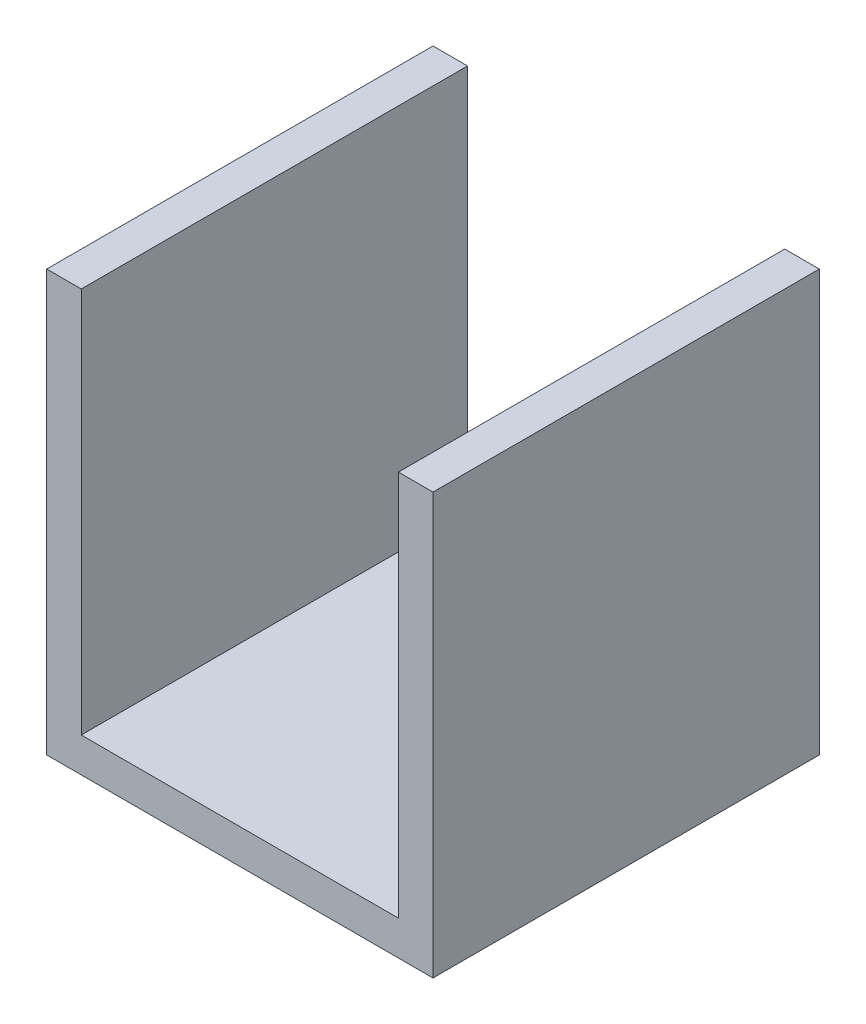
ISO-10303-21;
HEADER;
FILE_DESCRIPTION(('STEP AP214'),'2;1');
FILE_NAME('part.step','',(''),(''),'','','');
FILE_SCHEMA(('AUTOMOTIVE_DESIGN { 1 0 10303 214 1 1 1 1 }'));
ENDSEC;
DATA;
#1=APPLICATION_CONTEXT('core data for automotive mechanical design processes');
#2=APPLICATION_PROTOCOL_DEFINITION('international standard','automotive_design',2000,#1);
#3=PRODUCT_CONTEXT('',#1,'mechanical');
#4=PRODUCT('Part','Part','',(#3));
#5=PRODUCT_RELATED_PRODUCT_CATEGORY('part','',(#4));
#6=PRODUCT_DEFINITION_FORMATION('','',#4);
#7=PRODUCT_DEFINITION_CONTEXT('part definition',#1,'design');
#8=PRODUCT_DEFINITION('design','',#6,#7);
#9=PRODUCT_DEFINITION_SHAPE('','',#8);
#10=(LENGTH_UNIT() NAMED_UNIT(*) SI_UNIT(.MILLI.,.METRE.));
#11=(NAMED_UNIT(*) PLANE_ANGLE_UNIT() SI_UNIT($,.RADIAN.));
#12=(NAMED_UNIT(*) SI_UNIT($,.STERADIAN.) SOLID_ANGLE_UNIT());
#13=UNCERTAINTY_MEASURE_WITH_UNIT(LENGTH_MEASURE(1.E-05),#10,'distance_accuracy_value','');
#14=(GEOMETRIC_REPRESENTATION_CONTEXT(3) GLOBAL_UNCERTAINTY_ASSIGNED_CONTEXT((#13)) GLOBAL_UNIT_ASSIGNED_CONTEXT((#10,
#11,#12)) REPRESENTATION_CONTEXT('',''));
#15=CARTESIAN_POINT('',(0.,0.,0.));
#16=DIRECTION('',(0.,0.,1.));
#17=DIRECTION('',(1.,0.,0.));
#18=AXIS2_PLACEMENT_3D('',#15,#16,#17);
#19=CARTESIAN_POINT('',(0.,7.9502,0.));
#20=DIRECTION('',(0.,1.,0.));
#21=DIRECTION('',(0.,0.,1.));
#22=AXIS2_PLACEMENT_3D('',#19,#20,#21);
#23=PLANE('',#22);
#24=DIRECTION('',(1.,0.,0.));
#25=VECTOR('',#24,1.);
#26=CARTESIAN_POINT('',(0.,7.9502,0.));
#27=LINE('',#26,#25);
#28=CARTESIAN_POINT('',(7.9502,7.9502,0.));
#29=VERTEX_POINT('',#28);
#30=CARTESIAN_POINT('',(80.9498,7.9502,0.));
#31=VERTEX_POINT('',#30);
#32=EDGE_CURVE('E57',#29,#31,#27,.T.);
#33=ORIENTED_EDGE('',*,*,#32,.T.);
#34=DIRECTION('',(0.,0.,-1.));
#35=VECTOR('',#34,1.);
#36=CARTESIAN_POINT('',(80.9498,7.9502,0.));
#37=LINE('',#36,#35);
#38=CARTESIAN_POINT('',(80.9498,7.9502,-88.9));
#39=VERTEX_POINT('',#38);
#40=EDGE_CURVE('E61',#31,#39,#37,.T.);
#41=ORIENTED_EDGE('',*,*,#40,.T.);
#42=DIRECTION('',(-1.,0.,0.));
#43=VECTOR('',#42,1.);
#44=CARTESIAN_POINT('',(88.9,7.9502,-88.9));
#45=LINE('',#44,#43);
#46=CARTESIAN_POINT('',(7.9502,7.9502,-88.9));
#47=VERTEX_POINT('',#46);
#48=EDGE_CURVE('E152',#39,#47,#45,.T.);
#49=ORIENTED_EDGE('',*,*,#48,.T.);
#50=DIRECTION('',(0.,0.,1.));
#51=VECTOR('',#50,1.);
#52=CARTESIAN_POINT('',(7.9502,7.9502,0.));
#53=LINE('',#52,#51);
#54=EDGE_CURVE('E148',#47,#29,#53,.T.);
#55=ORIENTED_EDGE('',*,*,#54,.T.);
#56=EDGE_LOOP('',(#33,#41,#49,#55));
#57=FACE_BOUND('',#56,.T.);
#58=ADVANCED_FACE('F42',(#57),#23,.T.);
#59=CARTESIAN_POINT('',(0.,7.9502,-88.9));
#60=DIRECTION('',(1.,0.,0.));
#61=DIRECTION('',(0.,0.,-1.));
#62=AXIS2_PLACEMENT_3D('',#59,#60,#61);
#63=PLANE('',#62);
#64=DIRECTION('',(0.,0.,1.));
#65=VECTOR('',#64,1.);
#66=CARTESIAN_POINT('',(0.,0.,-88.9));
#67=LINE('',#66,#65);
#68=CARTESIAN_POINT('',(0.,0.,-88.9));
#69=VERTEX_POINT('',#68);
#70=CARTESIAN_POINT('',(0.,0.,0.));
#71=VERTEX_POINT('',#70);
#72=EDGE_CURVE('E150',#69,#71,#67,.T.);
#73=ORIENTED_EDGE('',*,*,#72,.T.);
#74=DIRECTION('',(0.,-1.,0.));
#75=VECTOR('',#74,1.);
#76=CARTESIAN_POINT('',(0.,7.9502,0.));
#77=LINE('',#76,#75);
#78=CARTESIAN_POINT('',(0.,96.8502,0.));
#79=VERTEX_POINT('',#78);
#80=EDGE_CURVE('E11',#79,#71,#77,.T.);
#81=ORIENTED_EDGE('',*,*,#80,.F.);
#82=DIRECTION('',(0.,0.,1.));
#83=VECTOR('',#82,1.);
#84=CARTESIAN_POINT('',(0.,96.8502,-88.9));
#85=LINE('',#84,#83);
#86=CARTESIAN_POINT('',(0.,96.8502,-88.9));
#87=VERTEX_POINT('',#86);
#88=EDGE_CURVE('E128',#87,#79,#85,.T.);
#89=ORIENTED_EDGE('',*,*,#88,.F.);
#90=DIRECTION('',(0.,-1.,0.));
#91=VECTOR('',#90,1.);
#92=CARTESIAN_POINT('',(0.,7.9502,-88.9));
#93=LINE('',#92,#91);
#94=EDGE_CURVE('E155',#87,#69,#93,.T.);
#95=ORIENTED_EDGE('',*,*,#94,.T.);
#96=EDGE_LOOP('',(#73,#81,#89,#95));
#97=FACE_BOUND('',#96,.T.);
#98=ADVANCED_FACE('F44',(#97),#63,.F.);
#99=CARTESIAN_POINT('',(0.,7.9502,0.));
#100=DIRECTION('',(0.,0.,-1.));
#101=DIRECTION('',(-1.,0.,0.));
#102=AXIS2_PLACEMENT_3D('',#99,#100,#101);
#103=PLANE('',#102);
#104=DIRECTION('',(0.,-1.,0.));
#105=VECTOR('',#104,1.);
#106=CARTESIAN_POINT('',(88.9,7.9502,0.));
#107=LINE('',#106,#105);
#108=CARTESIAN_POINT('',(88.9,96.8502,0.));
#109=VERTEX_POINT('',#108);
#110=CARTESIAN_POINT('',(88.9,0.,0.));
#111=VERTEX_POINT('',#110);
#112=EDGE_CURVE('E50',#109,#111,#107,.T.);
#113=ORIENTED_EDGE('',*,*,#112,.F.);
#114=DIRECTION('',(1.,0.,0.));
#115=VECTOR('',#114,1.);
#116=CARTESIAN_POINT('',(88.9,96.8502,0.));
#117=LINE('',#116,#115);
#118=CARTESIAN_POINT('',(80.9498,96.8502,0.));
#119=VERTEX_POINT('',#118);
#120=EDGE_CURVE('E108',#119,#109,#117,.T.);
#121=ORIENTED_EDGE('',*,*,#120,.F.);
#122=DIRECTION('',(0.,-1.,0.));
#123=VECTOR('',#122,1.);
#124=CARTESIAN_POINT('',(80.9498,96.8502,0.));
#125=LINE('',#124,#123);
#126=EDGE_CURVE('E121',#119,#31,#125,.T.);
#127=ORIENTED_EDGE('',*,*,#126,.T.);
#128=ORIENTED_EDGE('',*,*,#32,.F.);
#129=DIRECTION('',(0.,-1.,0.));
#130=VECTOR('',#129,1.);
#131=CARTESIAN_POINT('',(7.9502,96.8502,0.));
#132=LINE('',#131,#130);
#133=CARTESIAN_POINT('',(7.9502,96.8502,0.));
#134=VERTEX_POINT('',#133);
#135=EDGE_CURVE('E145',#134,#29,#132,.T.);
#136=ORIENTED_EDGE('',*,*,#135,.F.);
#137=DIRECTION('',(1.,0.,0.));
#138=VECTOR('',#137,1.);
#139=CARTESIAN_POINT('',(0.,96.8502,0.));
#140=LINE('',#139,#138);
#141=EDGE_CURVE('E135',#79,#134,#140,.T.);
#142=ORIENTED_EDGE('',*,*,#141,.F.);
#143=ORIENTED_EDGE('',*,*,#80,.T.);
#144=DIRECTION('',(1.,0.,0.));
#145=VECTOR('',#144,1.);
#146=CARTESIAN_POINT('',(0.,0.,0.));
#147=LINE('',#146,#145);
#148=EDGE_CURVE('E109',#71,#111,#147,.T.);
#149=ORIENTED_EDGE('',*,*,#148,.T.);
#150=EDGE_LOOP('',(#113,#121,#127,#128,#136,#142,#143,#149));
#151=FACE_BOUND('',#150,.T.);
#152=ADVANCED_FACE('F106',(#151),#103,.F.);
#153=CARTESIAN_POINT('',(88.9,7.9502,0.));
#154=DIRECTION('',(-1.,0.,0.));
#155=DIRECTION('',(0.,0.,1.));
#156=AXIS2_PLACEMENT_3D('',#153,#154,#155);
#157=PLANE('',#156);
#158=DIRECTION('',(0.,0.,-1.));
#159=VECTOR('',#158,1.);
#160=CARTESIAN_POINT('',(88.9,0.,0.));
#161=LINE('',#160,#159);
#162=CARTESIAN_POINT('',(88.9,0.,-88.9));
#163=VERTEX_POINT('',#162);
#164=EDGE_CURVE('E159',#111,#163,#161,.T.);
#165=ORIENTED_EDGE('',*,*,#164,.T.);
#166=DIRECTION('',(0.,-1.,0.));
#167=VECTOR('',#166,1.);
#168=CARTESIAN_POINT('',(88.9,7.9502,-88.9));
#169=LINE('',#168,#167);
#170=CARTESIAN_POINT('',(88.9,96.8502,-88.9));
#171=VERTEX_POINT('',#170);
#172=EDGE_CURVE('E113',#171,#163,#169,.T.);
#173=ORIENTED_EDGE('',*,*,#172,.F.);
#174=DIRECTION('',(0.,0.,-1.));
#175=VECTOR('',#174,1.);
#176=CARTESIAN_POINT('',(88.9,96.8502,-88.9));
#177=LINE('',#176,#175);
#178=EDGE_CURVE('E117',#109,#171,#177,.T.);
#179=ORIENTED_EDGE('',*,*,#178,.F.);
#180=ORIENTED_EDGE('',*,*,#112,.T.);
#181=EDGE_LOOP('',(#165,#173,#179,#180));
#182=FACE_BOUND('',#181,.T.);
#183=ADVANCED_FACE('F123',(#182),#157,.F.);
#184=CARTESIAN_POINT('',(88.9,7.9502,-88.9));
#185=DIRECTION('',(0.,0.,1.));
#186=DIRECTION('',(1.,0.,0.));
#187=AXIS2_PLACEMENT_3D('',#184,#185,#186);
#188=PLANE('',#187);
#189=DIRECTION('',(-1.,0.,0.));
#190=VECTOR('',#189,1.);
#191=CARTESIAN_POINT('',(88.9,0.,-88.9));
#192=LINE('',#191,#190);
#193=EDGE_CURVE('E153',#163,#69,#192,.T.);
#194=ORIENTED_EDGE('',*,*,#193,.T.);
#195=ORIENTED_EDGE('',*,*,#94,.F.);
#196=DIRECTION('',(-1.,0.,0.));
#197=VECTOR('',#196,1.);
#198=CARTESIAN_POINT('',(7.9502,96.8502,-88.9));
#199=LINE('',#198,#197);
#200=CARTESIAN_POINT('',(7.9502,96.8502,-88.9));
#201=VERTEX_POINT('',#200);
#202=EDGE_CURVE('E139',#201,#87,#199,.T.);
#203=ORIENTED_EDGE('',*,*,#202,.F.);
#204=DIRECTION('',(0.,-1.,0.));
#205=VECTOR('',#204,1.);
#206=CARTESIAN_POINT('',(7.9502,96.8502,-88.9));
#207=LINE('',#206,#205);
#208=EDGE_CURVE('E142',#201,#47,#207,.T.);
#209=ORIENTED_EDGE('',*,*,#208,.T.);
#210=ORIENTED_EDGE('',*,*,#48,.F.);
#211=DIRECTION('',(0.,-1.,0.));
#212=VECTOR('',#211,1.);
#213=CARTESIAN_POINT('',(80.9498,96.8502,-88.9));
#214=LINE('',#213,#212);
#215=CARTESIAN_POINT('',(80.9498,96.8502,-88.9));
#216=VERTEX_POINT('',#215);
#217=EDGE_CURVE('E184',#216,#39,#214,.T.);
#218=ORIENTED_EDGE('',*,*,#217,.F.);
#219=DIRECTION('',(-1.,0.,0.));
#220=VECTOR('',#219,1.);
#221=CARTESIAN_POINT('',(80.9498,96.8502,-88.9));
#222=LINE('',#221,#220);
#223=EDGE_CURVE('E126',#171,#216,#222,.T.);
#224=ORIENTED_EDGE('',*,*,#223,.F.);
#225=ORIENTED_EDGE('',*,*,#172,.T.);
#226=EDGE_LOOP('',(#194,#195,#203,#209,#210,#218,#224,#225));
#227=FACE_BOUND('',#226,.T.);
#228=ADVANCED_FACE('F166',(#227),#188,.F.);
#229=CARTESIAN_POINT('',(0.,0.,0.));
#230=DIRECTION('',(0.,1.,0.));
#231=DIRECTION('',(0.,0.,1.));
#232=AXIS2_PLACEMENT_3D('',#229,#230,#231);
#233=PLANE('',#232);
#234=ORIENTED_EDGE('',*,*,#164,.F.);
#235=ORIENTED_EDGE('',*,*,#148,.F.);
#236=ORIENTED_EDGE('',*,*,#72,.F.);
#237=ORIENTED_EDGE('',*,*,#193,.F.);
#238=EDGE_LOOP('',(#234,#235,#236,#237));
#239=FACE_BOUND('',#238,.T.);
#240=ADVANCED_FACE('F170',(#239),#233,.F.);
#241=CARTESIAN_POINT('',(7.9502,96.8502,0.));
#242=DIRECTION('',(-1.,0.,0.));
#243=DIRECTION('',(0.,0.,1.));
#244=AXIS2_PLACEMENT_3D('',#241,#242,#243);
#245=PLANE('',#244);
#246=ORIENTED_EDGE('',*,*,#54,.F.);
#247=ORIENTED_EDGE('',*,*,#208,.F.);
#248=DIRECTION('',(0.,0.,-1.));
#249=VECTOR('',#248,1.);
#250=CARTESIAN_POINT('',(7.9502,96.8502,0.));
#251=LINE('',#250,#249);
#252=EDGE_CURVE('E137',#134,#201,#251,.T.);
#253=ORIENTED_EDGE('',*,*,#252,.F.);
#254=ORIENTED_EDGE('',*,*,#135,.T.);
#255=EDGE_LOOP('',(#246,#247,#253,#254));
#256=FACE_BOUND('',#255,.T.);
#257=ADVANCED_FACE('F182',(#256),#245,.F.);
#258=CARTESIAN_POINT('',(0.,96.8502,0.));
#259=DIRECTION('',(0.,1.,0.));
#260=DIRECTION('',(0.,0.,1.));
#261=AXIS2_PLACEMENT_3D('',#258,#259,#260);
#262=PLANE('',#261);
#263=ORIENTED_EDGE('',*,*,#88,.T.);
#264=ORIENTED_EDGE('',*,*,#141,.T.);
#265=ORIENTED_EDGE('',*,*,#252,.T.);
#266=ORIENTED_EDGE('',*,*,#202,.T.);
#267=EDGE_LOOP('',(#263,#264,#265,#266));
#268=FACE_BOUND('',#267,.T.);
#269=ADVANCED_FACE('F176',(#268),#262,.T.);
#270=CARTESIAN_POINT('',(80.9498,96.8502,0.));
#271=DIRECTION('',(1.,0.,0.));
#272=DIRECTION('',(0.,0.,-1.));
#273=AXIS2_PLACEMENT_3D('',#270,#271,#272);
#274=PLANE('',#273);
#275=ORIENTED_EDGE('',*,*,#40,.F.);
#276=ORIENTED_EDGE('',*,*,#126,.F.);
#277=DIRECTION('',(0.,0.,1.));
#278=VECTOR('',#277,1.);
#279=CARTESIAN_POINT('',(80.9498,96.8502,0.));
#280=LINE('',#279,#278);
#281=EDGE_CURVE('E119',#216,#119,#280,.T.);
#282=ORIENTED_EDGE('',*,*,#281,.F.);
#283=ORIENTED_EDGE('',*,*,#217,.T.);
#284=EDGE_LOOP('',(#275,#276,#282,#283));
#285=FACE_BOUND('',#284,.T.);
#286=ADVANCED_FACE('F186',(#285),#274,.F.);
#287=CARTESIAN_POINT('',(0.,96.8502,0.));
#288=DIRECTION('',(0.,-1.,0.));
#289=DIRECTION('',(0.,0.,-1.));
#290=AXIS2_PLACEMENT_3D('',#287,#288,#289);
#291=PLANE('',#290);
#292=ORIENTED_EDGE('',*,*,#178,.T.);
#293=ORIENTED_EDGE('',*,*,#223,.T.);
#294=ORIENTED_EDGE('',*,*,#281,.T.);
#295=ORIENTED_EDGE('',*,*,#120,.T.);
#296=EDGE_LOOP('',(#292,#293,#294,#295));
#297=FACE_BOUND('',#296,.T.);
#298=ADVANCED_FACE('F116',(#297),#291,.F.);
#299=CLOSED_SHELL('',(#58,#98,#152,#183,#228,#240,#257,#269,#286,#298));
#300=MANIFOLD_SOLID_BREP('B2',#299);
#301=ADVANCED_BREP_SHAPE_REPRESENTATION('',(#18,#300),#14);
#302=SHAPE_DEFINITION_REPRESENTATION(#9,#301);
ENDSEC;
END-ISO-10303-21;
